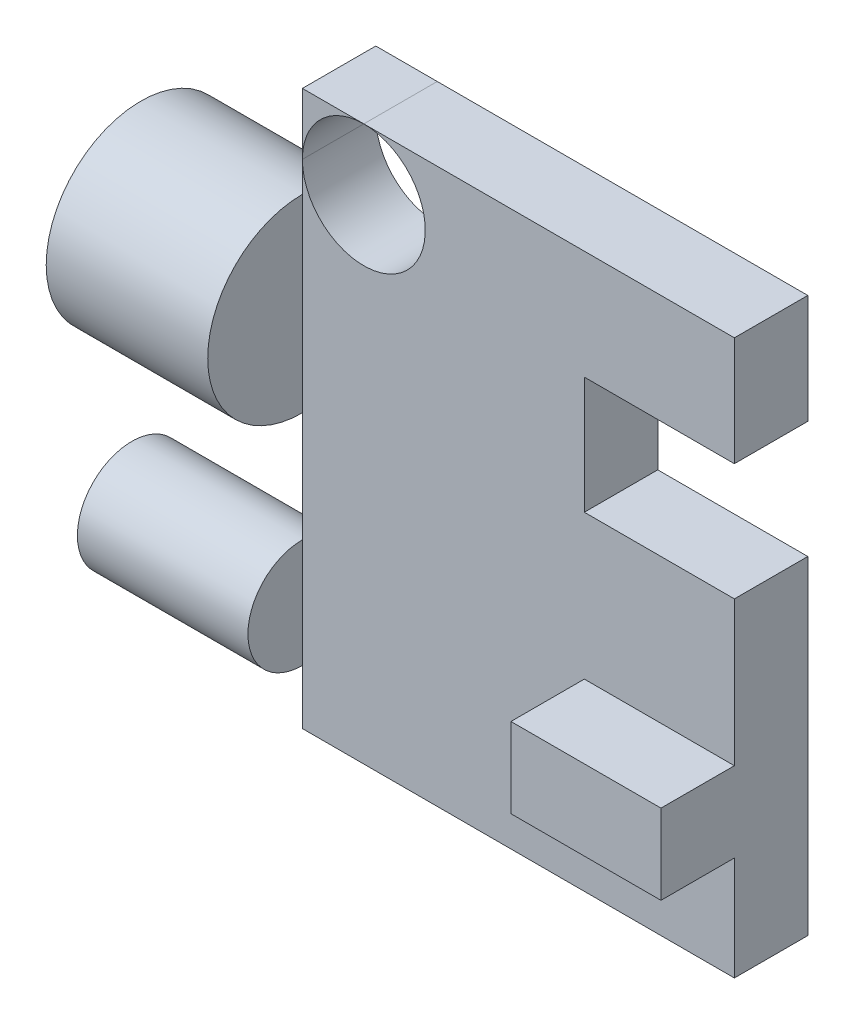
ISO-10303-21;
HEADER;
FILE_DESCRIPTION(('STEP AP214'),'2;1');
FILE_NAME('part.step','',(''),(''),'','','');
FILE_SCHEMA(('AUTOMOTIVE_DESIGN { 1 0 10303 214 1 1 1 1 }'));
ENDSEC;
DATA;
#1=APPLICATION_CONTEXT('core data for automotive mechanical design processes');
#2=APPLICATION_PROTOCOL_DEFINITION('international standard','automotive_design',2000,#1);
#3=PRODUCT_CONTEXT('',#1,'mechanical');
#4=PRODUCT('Part','Part','',(#3));
#5=PRODUCT_RELATED_PRODUCT_CATEGORY('part','',(#4));
#6=PRODUCT_DEFINITION_FORMATION('','',#4);
#7=PRODUCT_DEFINITION_CONTEXT('part definition',#1,'design');
#8=PRODUCT_DEFINITION('design','',#6,#7);
#9=PRODUCT_DEFINITION_SHAPE('','',#8);
#10=(LENGTH_UNIT() NAMED_UNIT(*) SI_UNIT(.MILLI.,.METRE.));
#11=(NAMED_UNIT(*) PLANE_ANGLE_UNIT() SI_UNIT($,.RADIAN.));
#12=(NAMED_UNIT(*) SI_UNIT($,.STERADIAN.) SOLID_ANGLE_UNIT());
#13=UNCERTAINTY_MEASURE_WITH_UNIT(LENGTH_MEASURE(1.E-05),#10,'distance_accuracy_value','');
#14=(GEOMETRIC_REPRESENTATION_CONTEXT(3) GLOBAL_UNCERTAINTY_ASSIGNED_CONTEXT((#13)) GLOBAL_UNIT_ASSIGNED_CONTEXT((#10,
#11,#12)) REPRESENTATION_CONTEXT('',''));
#15=CARTESIAN_POINT('',(0.,0.,0.));
#16=DIRECTION('',(0.,0.,1.));
#17=DIRECTION('',(1.,0.,0.));
#18=AXIS2_PLACEMENT_3D('',#15,#16,#17);
#19=CARTESIAN_POINT('',(0.,0.,10.));
#20=DIRECTION('',(1.,0.,0.));
#21=DIRECTION('',(0.,0.,-1.));
#22=AXIS2_PLACEMENT_3D('',#19,#20,#21);
#23=PLANE('',#22);
#24=DIRECTION('',(0.,0.,1.));
#25=VECTOR('',#24,1.);
#26=CARTESIAN_POINT('',(0.,67.1497486725571,0.));
#27=LINE('',#26,#25);
#28=CARTESIAN_POINT('',(0.,67.1497486725571,0.));
#29=VERTEX_POINT('',#28);
#30=CARTESIAN_POINT('',(0.,67.1497486725571,10.));
#31=VERTEX_POINT('',#30);
#32=EDGE_CURVE('E214',#29,#31,#27,.T.);
#33=ORIENTED_EDGE('',*,*,#32,.F.);
#34=DIRECTION('',(0.,-1.,0.));
#35=VECTOR('',#34,1.);
#36=CARTESIAN_POINT('',(0.,0.,0.));
#37=LINE('',#36,#35);
#38=CARTESIAN_POINT('',(0.,58.2671488390325,0.));
#39=VERTEX_POINT('',#38);
#40=EDGE_CURVE('E223',#29,#39,#37,.T.);
#41=ORIENTED_EDGE('',*,*,#40,.T.);
#42=CARTESIAN_POINT('',(0.,50.131757446474,10.));
#43=DIRECTION('',(-1.,0.,0.));
#44=DIRECTION('',(0.,0.,1.));
#45=AXIS2_PLACEMENT_3D('',#42,#43,#44);
#46=CIRCLE('',#45,12.8912603383112);
#47=CARTESIAN_POINT('',(0.,63.0230177847852,10.));
#48=VERTEX_POINT('',#47);
#49=EDGE_CURVE('E253',#48,#39,#46,.T.);
#50=ORIENTED_EDGE('',*,*,#49,.F.);
#51=DIRECTION('',(0.,-1.,0.));
#52=VECTOR('',#51,1.);
#53=CARTESIAN_POINT('',(0.,0.,10.));
#54=LINE('',#53,#52);
#55=EDGE_CURVE('E216',#31,#48,#54,.T.);
#56=ORIENTED_EDGE('',*,*,#55,.F.);
#57=EDGE_LOOP('',(#33,#41,#50,#56));
#58=FACE_BOUND('',#57,.T.);
#59=ADVANCED_FACE('F55',(#58),#23,.F.);
#60=CARTESIAN_POINT('',(0.,0.,10.));
#61=DIRECTION('',(0.,0.,-1.));
#62=DIRECTION('',(-1.,0.,0.));
#63=AXIS2_PLACEMENT_3D('',#60,#61,#62);
#64=PLANE('',#63);
#65=DIRECTION('',(-1.,0.,0.));
#66=VECTOR('',#65,1.);
#67=CARTESIAN_POINT('',(0.,75.5206119855441,10.));
#68=LINE('',#67,#66);
#69=CARTESIAN_POINT('',(58.8472301186058,75.5206119855441,10.));
#70=VERTEX_POINT('',#69);
#71=CARTESIAN_POINT('',(8.37086331298698,75.5206119855441,10.));
#72=VERTEX_POINT('',#71);
#73=EDGE_CURVE('E219',#70,#72,#68,.T.);
#74=ORIENTED_EDGE('',*,*,#73,.T.);
#75=CARTESIAN_POINT('',(8.37086331298698,67.1497486725571,10.));
#76=DIRECTION('',(0.,0.,1.));
#77=DIRECTION('',(1.,0.,0.));
#78=AXIS2_PLACEMENT_3D('',#75,#76,#77);
#79=CIRCLE('',#78,8.37086331298698);
#80=EDGE_CURVE('E59',#31,#72,#79,.T.);
#81=ORIENTED_EDGE('',*,*,#80,.F.);
#82=ORIENTED_EDGE('',*,*,#55,.T.);
#83=CARTESIAN_POINT('',(0.,37.2404971081628,10.));
#84=VERTEX_POINT('',#83);
#85=EDGE_CURVE('E218',#48,#84,#54,.T.);
#86=ORIENTED_EDGE('',*,*,#85,.T.);
#87=CARTESIAN_POINT('',(0.,22.2700012314142,10.));
#88=VERTEX_POINT('',#87);
#89=EDGE_CURVE('E328',#84,#88,#54,.T.);
#90=ORIENTED_EDGE('',*,*,#89,.T.);
#91=CARTESIAN_POINT('',(0.,7.43812105722822,10.));
#92=VERTEX_POINT('',#91);
#93=EDGE_CURVE('E545',#88,#92,#54,.T.);
#94=ORIENTED_EDGE('',*,*,#93,.T.);
#95=CARTESIAN_POINT('',(0.,0.,10.));
#96=VERTEX_POINT('',#95);
#97=EDGE_CURVE('E220',#92,#96,#54,.T.);
#98=ORIENTED_EDGE('',*,*,#97,.T.);
#99=DIRECTION('',(1.,0.,0.));
#100=VECTOR('',#99,1.);
#101=CARTESIAN_POINT('',(0.,0.,10.));
#102=LINE('',#101,#100);
#103=CARTESIAN_POINT('',(58.8472301186058,0.,10.));
#104=VERTEX_POINT('',#103);
#105=EDGE_CURVE('E249',#96,#104,#102,.T.);
#106=ORIENTED_EDGE('',*,*,#105,.T.);
#107=DIRECTION('',(0.,1.,0.));
#108=VECTOR('',#107,1.);
#109=CARTESIAN_POINT('',(58.8472301186058,75.5206119855441,10.));
#110=LINE('',#109,#108);
#111=CARTESIAN_POINT('',(58.8472301186058,14.1609826315088,10.));
#112=VERTEX_POINT('',#111);
#113=EDGE_CURVE('E210',#104,#112,#110,.T.);
#114=ORIENTED_EDGE('',*,*,#113,.T.);
#115=DIRECTION('',(-1.,0.,0.));
#116=VECTOR('',#115,1.);
#117=CARTESIAN_POINT('',(0.,14.1609826315088,10.));
#118=LINE('',#117,#116);
#119=CARTESIAN_POINT('',(38.4092967616959,14.1609826315088,10.));
#120=VERTEX_POINT('',#119);
#121=EDGE_CURVE('E208',#112,#120,#118,.T.);
#122=ORIENTED_EDGE('',*,*,#121,.T.);
#123=DIRECTION('',(0.,-1.,0.));
#124=VECTOR('',#123,1.);
#125=CARTESIAN_POINT('',(38.4092967616959,0.,10.));
#126=LINE('',#125,#124);
#127=CARTESIAN_POINT('',(38.4092967616959,25.0423152826639,10.));
#128=VERTEX_POINT('',#127);
#129=EDGE_CURVE('E192',#128,#120,#126,.T.);
#130=ORIENTED_EDGE('',*,*,#129,.F.);
#131=DIRECTION('',(-1.,0.,0.));
#132=VECTOR('',#131,1.);
#133=CARTESIAN_POINT('',(0.,25.0423152826639,10.));
#134=LINE('',#133,#132);
#135=CARTESIAN_POINT('',(58.8472301186058,25.0423152826639,10.));
#136=VERTEX_POINT('',#135);
#137=EDGE_CURVE('E190',#136,#128,#134,.T.);
#138=ORIENTED_EDGE('',*,*,#137,.F.);
#139=CARTESIAN_POINT('',(58.8472301186058,44.725745046537,10.));
#140=VERTEX_POINT('',#139);
#141=EDGE_CURVE('E209',#136,#140,#110,.T.);
#142=ORIENTED_EDGE('',*,*,#141,.T.);
#143=DIRECTION('',(-1.,0.,0.));
#144=VECTOR('',#143,1.);
#145=CARTESIAN_POINT('',(0.,44.725745046537,10.));
#146=LINE('',#145,#144);
#147=CARTESIAN_POINT('',(38.4092967616959,44.725745046537,10.));
#148=VERTEX_POINT('',#147);
#149=EDGE_CURVE('E279',#140,#148,#146,.T.);
#150=ORIENTED_EDGE('',*,*,#149,.T.);
#151=DIRECTION('',(0.,-1.,0.));
#152=VECTOR('',#151,1.);
#153=CARTESIAN_POINT('',(38.4092967616959,0.,10.));
#154=LINE('',#153,#152);
#155=CARTESIAN_POINT('',(38.4092967616959,60.6665508412229,10.));
#156=VERTEX_POINT('',#155);
#157=EDGE_CURVE('E271',#156,#148,#154,.T.);
#158=ORIENTED_EDGE('',*,*,#157,.F.);
#159=DIRECTION('',(-1.,0.,0.));
#160=VECTOR('',#159,1.);
#161=CARTESIAN_POINT('',(0.,60.6665508412229,10.));
#162=LINE('',#161,#160);
#163=CARTESIAN_POINT('',(58.8472301186058,60.6665508412229,10.));
#164=VERTEX_POINT('',#163);
#165=EDGE_CURVE('E269',#164,#156,#162,.T.);
#166=ORIENTED_EDGE('',*,*,#165,.F.);
#167=EDGE_CURVE('E250',#164,#70,#110,.T.);
#168=ORIENTED_EDGE('',*,*,#167,.T.);
#169=EDGE_LOOP('',(#74,#81,#82,#86,#90,#94,#98,#106,#114,#122,#130,#138,#142,#150,#158,#166,#168));
#170=FACE_BOUND('',#169,.T.);
#171=ADVANCED_FACE('F305',(#170),#64,.F.);
#172=CARTESIAN_POINT('',(58.8472301186058,75.5206119855441,10.));
#173=DIRECTION('',(-1.,0.,0.));
#174=DIRECTION('',(0.,0.,1.));
#175=AXIS2_PLACEMENT_3D('',#172,#173,#174);
#176=PLANE('',#175);
#177=DIRECTION('',(0.,0.,1.));
#178=VECTOR('',#177,1.);
#179=CARTESIAN_POINT('',(58.8472301186058,44.725745046537,0.));
#180=LINE('',#179,#178);
#181=CARTESIAN_POINT('',(58.8472301186058,44.725745046537,0.));
#182=VERTEX_POINT('',#181);
#183=EDGE_CURVE('E206',#182,#140,#180,.T.);
#184=ORIENTED_EDGE('',*,*,#183,.T.);
#185=ORIENTED_EDGE('',*,*,#141,.F.);
#186=DIRECTION('',(0.,0.,-1.));
#187=VECTOR('',#186,1.);
#188=CARTESIAN_POINT('',(58.8472301186058,25.0423152826639,20.));
#189=LINE('',#188,#187);
#190=CARTESIAN_POINT('',(58.8472301186058,25.0423152826639,20.));
#191=VERTEX_POINT('',#190);
#192=EDGE_CURVE('E195',#191,#136,#189,.T.);
#193=ORIENTED_EDGE('',*,*,#192,.F.);
#194=DIRECTION('',(0.,1.,0.));
#195=VECTOR('',#194,1.);
#196=CARTESIAN_POINT('',(58.8472301186058,0.,20.));
#197=LINE('',#196,#195);
#198=CARTESIAN_POINT('',(58.8472301186058,14.1609826315088,20.));
#199=VERTEX_POINT('',#198);
#200=EDGE_CURVE('E178',#199,#191,#197,.T.);
#201=ORIENTED_EDGE('',*,*,#200,.F.);
#202=DIRECTION('',(0.,0.,-1.));
#203=VECTOR('',#202,1.);
#204=CARTESIAN_POINT('',(58.8472301186058,14.1609826315088,20.));
#205=LINE('',#204,#203);
#206=EDGE_CURVE('E202',#199,#112,#205,.T.);
#207=ORIENTED_EDGE('',*,*,#206,.T.);
#208=ORIENTED_EDGE('',*,*,#113,.F.);
#209=DIRECTION('',(0.,0.,-1.));
#210=VECTOR('',#209,1.);
#211=CARTESIAN_POINT('',(58.8472301186058,0.,10.));
#212=LINE('',#211,#210);
#213=CARTESIAN_POINT('',(58.8472301186058,0.,0.));
#214=VERTEX_POINT('',#213);
#215=EDGE_CURVE('E205',#104,#214,#212,.T.);
#216=ORIENTED_EDGE('',*,*,#215,.T.);
#217=DIRECTION('',(0.,1.,0.));
#218=VECTOR('',#217,1.);
#219=CARTESIAN_POINT('',(58.8472301186058,75.5206119855441,0.));
#220=LINE('',#219,#218);
#221=EDGE_CURVE('E243',#214,#182,#220,.T.);
#222=ORIENTED_EDGE('',*,*,#221,.T.);
#223=EDGE_LOOP('',(#184,#185,#193,#201,#207,#208,#216,#222));
#224=FACE_BOUND('',#223,.T.);
#225=ADVANCED_FACE('F310',(#224),#176,.F.);
#226=CARTESIAN_POINT('',(0.,0.,10.));
#227=DIRECTION('',(0.,1.,0.));
#228=DIRECTION('',(0.,0.,1.));
#229=AXIS2_PLACEMENT_3D('',#226,#227,#228);
#230=PLANE('',#229);
#231=DIRECTION('',(1.,0.,0.));
#232=VECTOR('',#231,1.);
#233=CARTESIAN_POINT('',(0.,0.,0.));
#234=LINE('',#233,#232);
#235=CARTESIAN_POINT('',(0.,0.,0.));
#236=VERTEX_POINT('',#235);
#237=EDGE_CURVE('E242',#236,#214,#234,.T.);
#238=ORIENTED_EDGE('',*,*,#237,.T.);
#239=ORIENTED_EDGE('',*,*,#215,.F.);
#240=ORIENTED_EDGE('',*,*,#105,.F.);
#241=DIRECTION('',(0.,0.,-1.));
#242=VECTOR('',#241,1.);
#243=CARTESIAN_POINT('',(0.,0.,10.));
#244=LINE('',#243,#242);
#245=EDGE_CURVE('E239',#96,#236,#244,.T.);
#246=ORIENTED_EDGE('',*,*,#245,.T.);
#247=EDGE_LOOP('',(#238,#239,#240,#246));
#248=FACE_BOUND('',#247,.T.);
#249=ADVANCED_FACE('F317',(#248),#230,.F.);
#250=ORIENTED_EDGE('',*,*,#167,.F.);
#251=DIRECTION('',(0.,0.,1.));
#252=VECTOR('',#251,1.);
#253=CARTESIAN_POINT('',(58.8472301186058,60.6665508412229,0.));
#254=LINE('',#253,#252);
#255=CARTESIAN_POINT('',(58.8472301186058,60.6665508412229,0.));
#256=VERTEX_POINT('',#255);
#257=EDGE_CURVE('E277',#256,#164,#254,.T.);
#258=ORIENTED_EDGE('',*,*,#257,.F.);
#259=CARTESIAN_POINT('',(58.8472301186058,75.5206119855441,0.));
#260=VERTEX_POINT('',#259);
#261=EDGE_CURVE('E229',#256,#260,#220,.T.);
#262=ORIENTED_EDGE('',*,*,#261,.T.);
#263=DIRECTION('',(0.,0.,-1.));
#264=VECTOR('',#263,1.);
#265=CARTESIAN_POINT('',(58.8472301186058,75.5206119855441,10.));
#266=LINE('',#265,#264);
#267=EDGE_CURVE('E230',#70,#260,#266,.T.);
#268=ORIENTED_EDGE('',*,*,#267,.F.);
#269=EDGE_LOOP('',(#250,#258,#262,#268));
#270=FACE_BOUND('',#269,.T.);
#271=ADVANCED_FACE('F302',(#270),#176,.F.);
#272=CARTESIAN_POINT('',(0.,75.5206119855441,10.));
#273=DIRECTION('',(0.,-1.,0.));
#274=DIRECTION('',(0.,0.,-1.));
#275=AXIS2_PLACEMENT_3D('',#272,#273,#274);
#276=PLANE('',#275);
#277=DIRECTION('',(-1.,0.,0.));
#278=VECTOR('',#277,1.);
#279=CARTESIAN_POINT('',(0.,75.5206119855441,0.));
#280=LINE('',#279,#278);
#281=CARTESIAN_POINT('',(8.37086331298698,75.5206119855441,0.));
#282=VERTEX_POINT('',#281);
#283=EDGE_CURVE('E227',#260,#282,#280,.T.);
#284=ORIENTED_EDGE('',*,*,#283,.T.);
#285=DIRECTION('',(0.,0.,1.));
#286=VECTOR('',#285,1.);
#287=CARTESIAN_POINT('',(8.37086331298698,75.5206119855441,0.));
#288=LINE('',#287,#286);
#289=EDGE_CURVE('E75',#282,#72,#288,.T.);
#290=ORIENTED_EDGE('',*,*,#289,.T.);
#291=ORIENTED_EDGE('',*,*,#73,.F.);
#292=ORIENTED_EDGE('',*,*,#267,.T.);
#293=EDGE_LOOP('',(#284,#290,#291,#292));
#294=FACE_BOUND('',#293,.T.);
#295=ADVANCED_FACE('F343',(#294),#276,.F.);
#296=CARTESIAN_POINT('',(0.,14.8540611443212,10.));
#297=DIRECTION('',(-1.,0.,0.));
#298=DIRECTION('',(0.,-1.,0.));
#299=AXIS2_PLACEMENT_3D('',#296,#297,#298);
#300=CIRCLE('',#299,7.41594008709301);
#301=EDGE_CURVE('E265',#88,#92,#300,.T.);
#302=ORIENTED_EDGE('',*,*,#301,.F.);
#303=ORIENTED_EDGE('',*,*,#89,.F.);
#304=CARTESIAN_POINT('',(0.,41.9963660539154,0.));
#305=VERTEX_POINT('',#304);
#306=EDGE_CURVE('E258',#305,#84,#46,.T.);
#307=ORIENTED_EDGE('',*,*,#306,.F.);
#308=EDGE_CURVE('E226',#305,#236,#37,.T.);
#309=ORIENTED_EDGE('',*,*,#308,.T.);
#310=ORIENTED_EDGE('',*,*,#245,.F.);
#311=ORIENTED_EDGE('',*,*,#97,.F.);
#312=EDGE_LOOP('',(#302,#303,#307,#309,#310,#311));
#313=FACE_BOUND('',#312,.T.);
#314=ADVANCED_FACE('F323',(#313),#23,.F.);
#315=CARTESIAN_POINT('',(0.,0.,0.));
#316=DIRECTION('',(0.,0.,-1.));
#317=DIRECTION('',(-1.,0.,0.));
#318=AXIS2_PLACEMENT_3D('',#315,#316,#317);
#319=PLANE('',#318);
#320=CARTESIAN_POINT('',(8.37086331298698,67.1497486725571,0.));
#321=DIRECTION('',(0.,0.,-1.));
#322=DIRECTION('',(-1.,0.,0.));
#323=AXIS2_PLACEMENT_3D('',#320,#321,#322);
#324=CIRCLE('',#323,8.37086331298698);
#325=EDGE_CURVE('E12',#282,#29,#324,.T.);
#326=ORIENTED_EDGE('',*,*,#325,.F.);
#327=ORIENTED_EDGE('',*,*,#283,.F.);
#328=ORIENTED_EDGE('',*,*,#261,.F.);
#329=DIRECTION('',(-1.,0.,0.));
#330=VECTOR('',#329,1.);
#331=CARTESIAN_POINT('',(0.,60.6665508412229,0.));
#332=LINE('',#331,#330);
#333=CARTESIAN_POINT('',(38.4092967616959,60.6665508412229,0.));
#334=VERTEX_POINT('',#333);
#335=EDGE_CURVE('E199',#256,#334,#332,.T.);
#336=ORIENTED_EDGE('',*,*,#335,.T.);
#337=DIRECTION('',(0.,-1.,0.));
#338=VECTOR('',#337,1.);
#339=CARTESIAN_POINT('',(38.4092967616959,0.,0.));
#340=LINE('',#339,#338);
#341=CARTESIAN_POINT('',(38.4092967616959,44.725745046537,0.));
#342=VERTEX_POINT('',#341);
#343=EDGE_CURVE('E287',#334,#342,#340,.T.);
#344=ORIENTED_EDGE('',*,*,#343,.T.);
#345=DIRECTION('',(-1.,0.,0.));
#346=VECTOR('',#345,1.);
#347=CARTESIAN_POINT('',(0.,44.725745046537,0.));
#348=LINE('',#347,#346);
#349=EDGE_CURVE('E274',#182,#342,#348,.T.);
#350=ORIENTED_EDGE('',*,*,#349,.F.);
#351=ORIENTED_EDGE('',*,*,#221,.F.);
#352=ORIENTED_EDGE('',*,*,#237,.F.);
#353=ORIENTED_EDGE('',*,*,#308,.F.);
#354=EDGE_CURVE('E225',#39,#305,#37,.T.);
#355=ORIENTED_EDGE('',*,*,#354,.F.);
#356=ORIENTED_EDGE('',*,*,#40,.F.);
#357=EDGE_LOOP('',(#326,#327,#328,#336,#344,#350,#351,#352,#353,#355,#356));
#358=FACE_BOUND('',#357,.T.);
#359=ADVANCED_FACE('F295',(#358),#319,.T.);
#360=CARTESIAN_POINT('',(0.,63.0230177847852,10.));
#361=DIRECTION('',(-1.,0.,0.));
#362=DIRECTION('',(0.,0.,1.));
#363=AXIS2_PLACEMENT_3D('',#360,#361,#362);
#364=PLANE('',#363);
#365=EDGE_CURVE('E256',#39,#305,#46,.T.);
#366=ORIENTED_EDGE('',*,*,#365,.F.);
#367=ORIENTED_EDGE('',*,*,#354,.T.);
#368=EDGE_LOOP('',(#366,#367));
#369=FACE_BOUND('',#368,.T.);
#370=ADVANCED_FACE('F337',(#369),#364,.F.);
#371=ORIENTED_EDGE('',*,*,#85,.F.);
#372=EDGE_CURVE('E257',#84,#48,#46,.T.);
#373=ORIENTED_EDGE('',*,*,#372,.F.);
#374=EDGE_LOOP('',(#371,#373));
#375=FACE_BOUND('',#374,.T.);
#376=ADVANCED_FACE('F365',(#375),#364,.F.);
#377=CARTESIAN_POINT('',(-22.0028105913794,50.131757446474,10.));
#378=DIRECTION('',(-1.,0.,0.));
#379=DIRECTION('',(0.,0.,1.));
#380=AXIS2_PLACEMENT_3D('',#377,#378,#379);
#381=CYLINDRICAL_SURFACE('',#380,12.8912603383112);
#382=CARTESIAN_POINT('',(-22.0028105913794,50.131757446474,10.));
#383=DIRECTION('',(-1.,0.,0.));
#384=DIRECTION('',(0.,0.,1.));
#385=AXIS2_PLACEMENT_3D('',#382,#383,#384);
#386=CIRCLE('',#385,12.8912603383112);
#387=CARTESIAN_POINT('',(-22.0028105913794,50.131757446474,22.8912603383112));
#388=VERTEX_POINT('',#387);
#389=EDGE_CURVE('E259',#388,#388,#386,.T.);
#390=ORIENTED_EDGE('',*,*,#389,.F.);
#391=EDGE_LOOP('',(#390));
#392=FACE_BOUND('',#391,.T.);
#393=ORIENTED_EDGE('',*,*,#49,.T.);
#394=ORIENTED_EDGE('',*,*,#365,.T.);
#395=ORIENTED_EDGE('',*,*,#306,.T.);
#396=ORIENTED_EDGE('',*,*,#372,.T.);
#397=EDGE_LOOP('',(#393,#394,#395,#396));
#398=FACE_BOUND('',#397,.T.);
#399=ADVANCED_FACE('F334',(#392,#398),#381,.T.);
#400=CARTESIAN_POINT('',(-22.0028105913794,63.0230177847852,10.));
#401=DIRECTION('',(1.,0.,0.));
#402=DIRECTION('',(0.,0.,-1.));
#403=AXIS2_PLACEMENT_3D('',#400,#401,#402);
#404=PLANE('',#403);
#405=ORIENTED_EDGE('',*,*,#389,.T.);
#406=EDGE_LOOP('',(#405));
#407=FACE_BOUND('',#406,.T.);
#408=ADVANCED_FACE('F371',(#407),#404,.F.);
#409=CARTESIAN_POINT('',(0.,14.8540611443212,10.));
#410=DIRECTION('',(-1.,0.,0.));
#411=DIRECTION('',(0.,-1.,0.));
#412=AXIS2_PLACEMENT_3D('',#409,#410,#411);
#413=PLANE('',#412);
#414=EDGE_CURVE('E262',#92,#88,#300,.T.);
#415=ORIENTED_EDGE('',*,*,#414,.F.);
#416=ORIENTED_EDGE('',*,*,#93,.F.);
#417=EDGE_LOOP('',(#415,#416));
#418=FACE_BOUND('',#417,.T.);
#419=ADVANCED_FACE('F375',(#418),#413,.F.);
#420=CARTESIAN_POINT('',(-23.2318088564139,14.8540611443212,10.));
#421=DIRECTION('',(-1.,0.,0.));
#422=DIRECTION('',(0.,-1.,0.));
#423=AXIS2_PLACEMENT_3D('',#420,#421,#422);
#424=CYLINDRICAL_SURFACE('',#423,7.41594008709301);
#425=CARTESIAN_POINT('',(-23.2318088564139,14.8540611443212,10.));
#426=DIRECTION('',(-1.,0.,0.));
#427=DIRECTION('',(0.,-1.,0.));
#428=AXIS2_PLACEMENT_3D('',#425,#426,#427);
#429=CIRCLE('',#428,7.41594008709301);
#430=CARTESIAN_POINT('',(-23.2318088564139,7.43812105722822,10.));
#431=VERTEX_POINT('',#430);
#432=EDGE_CURVE('E266',#431,#431,#429,.T.);
#433=ORIENTED_EDGE('',*,*,#432,.F.);
#434=EDGE_LOOP('',(#433));
#435=FACE_BOUND('',#434,.T.);
#436=ORIENTED_EDGE('',*,*,#414,.T.);
#437=ORIENTED_EDGE('',*,*,#301,.T.);
#438=EDGE_LOOP('',(#436,#437));
#439=FACE_BOUND('',#438,.T.);
#440=ADVANCED_FACE('F379',(#435,#439),#424,.T.);
#441=CARTESIAN_POINT('',(-23.2318088564139,22.2700012314142,10.));
#442=DIRECTION('',(1.,0.,0.));
#443=DIRECTION('',(0.,1.,0.));
#444=AXIS2_PLACEMENT_3D('',#441,#442,#443);
#445=PLANE('',#444);
#446=ORIENTED_EDGE('',*,*,#432,.T.);
#447=EDGE_LOOP('',(#446));
#448=FACE_BOUND('',#447,.T.);
#449=ADVANCED_FACE('F383',(#448),#445,.F.);
#450=CARTESIAN_POINT('',(0.,60.6665508412229,0.));
#451=DIRECTION('',(0.,1.,0.));
#452=DIRECTION('',(0.,0.,1.));
#453=AXIS2_PLACEMENT_3D('',#450,#451,#452);
#454=PLANE('',#453);
#455=ORIENTED_EDGE('',*,*,#165,.T.);
#456=DIRECTION('',(0.,0.,1.));
#457=VECTOR('',#456,1.);
#458=CARTESIAN_POINT('',(38.4092967616959,60.6665508412229,0.));
#459=LINE('',#458,#457);
#460=EDGE_CURVE('E213',#334,#156,#459,.T.);
#461=ORIENTED_EDGE('',*,*,#460,.F.);
#462=ORIENTED_EDGE('',*,*,#335,.F.);
#463=ORIENTED_EDGE('',*,*,#257,.T.);
#464=EDGE_LOOP('',(#455,#461,#462,#463));
#465=FACE_BOUND('',#464,.T.);
#466=ADVANCED_FACE('F298',(#465),#454,.F.);
#467=CARTESIAN_POINT('',(0.,44.725745046537,0.));
#468=DIRECTION('',(0.,1.,0.));
#469=DIRECTION('',(0.,0.,1.));
#470=AXIS2_PLACEMENT_3D('',#467,#468,#469);
#471=PLANE('',#470);
#472=ORIENTED_EDGE('',*,*,#149,.F.);
#473=ORIENTED_EDGE('',*,*,#183,.F.);
#474=ORIENTED_EDGE('',*,*,#349,.T.);
#475=DIRECTION('',(0.,0.,1.));
#476=VECTOR('',#475,1.);
#477=CARTESIAN_POINT('',(38.4092967616959,44.725745046537,0.));
#478=LINE('',#477,#476);
#479=EDGE_CURVE('E272',#342,#148,#478,.T.);
#480=ORIENTED_EDGE('',*,*,#479,.T.);
#481=EDGE_LOOP('',(#472,#473,#474,#480));
#482=FACE_BOUND('',#481,.T.);
#483=ADVANCED_FACE('F309',(#482),#471,.T.);
#484=CARTESIAN_POINT('',(38.4092967616959,0.,0.));
#485=DIRECTION('',(-1.,0.,0.));
#486=DIRECTION('',(0.,0.,1.));
#487=AXIS2_PLACEMENT_3D('',#484,#485,#486);
#488=PLANE('',#487);
#489=ORIENTED_EDGE('',*,*,#157,.T.);
#490=ORIENTED_EDGE('',*,*,#479,.F.);
#491=ORIENTED_EDGE('',*,*,#343,.F.);
#492=ORIENTED_EDGE('',*,*,#460,.T.);
#493=EDGE_LOOP('',(#489,#490,#491,#492));
#494=FACE_BOUND('',#493,.T.);
#495=ADVANCED_FACE('F390',(#494),#488,.F.);
#496=CARTESIAN_POINT('',(0.,25.0423152826639,20.));
#497=DIRECTION('',(0.,-1.,0.));
#498=DIRECTION('',(0.,0.,-1.));
#499=AXIS2_PLACEMENT_3D('',#496,#497,#498);
#500=PLANE('',#499);
#501=ORIENTED_EDGE('',*,*,#137,.T.);
#502=DIRECTION('',(0.,0.,-1.));
#503=VECTOR('',#502,1.);
#504=CARTESIAN_POINT('',(38.4092967616959,25.0423152826639,20.));
#505=LINE('',#504,#503);
#506=CARTESIAN_POINT('',(38.4092967616959,25.0423152826639,20.));
#507=VERTEX_POINT('',#506);
#508=EDGE_CURVE('E171',#507,#128,#505,.T.);
#509=ORIENTED_EDGE('',*,*,#508,.F.);
#510=DIRECTION('',(-1.,0.,0.));
#511=VECTOR('',#510,1.);
#512=CARTESIAN_POINT('',(0.,25.0423152826639,20.));
#513=LINE('',#512,#511);
#514=EDGE_CURVE('E179',#191,#507,#513,.T.);
#515=ORIENTED_EDGE('',*,*,#514,.F.);
#516=ORIENTED_EDGE('',*,*,#192,.T.);
#517=EDGE_LOOP('',(#501,#509,#515,#516));
#518=FACE_BOUND('',#517,.T.);
#519=ADVANCED_FACE('F188',(#518),#500,.F.);
#520=CARTESIAN_POINT('',(38.4092967616959,0.,20.));
#521=DIRECTION('',(1.,0.,0.));
#522=DIRECTION('',(0.,0.,-1.));
#523=AXIS2_PLACEMENT_3D('',#520,#521,#522);
#524=PLANE('',#523);
#525=ORIENTED_EDGE('',*,*,#129,.T.);
#526=DIRECTION('',(0.,0.,-1.));
#527=VECTOR('',#526,1.);
#528=CARTESIAN_POINT('',(38.4092967616959,14.1609826315088,20.));
#529=LINE('',#528,#527);
#530=CARTESIAN_POINT('',(38.4092967616959,14.1609826315088,20.));
#531=VERTEX_POINT('',#530);
#532=EDGE_CURVE('E174',#531,#120,#529,.T.);
#533=ORIENTED_EDGE('',*,*,#532,.F.);
#534=DIRECTION('',(0.,-1.,0.));
#535=VECTOR('',#534,1.);
#536=CARTESIAN_POINT('',(38.4092967616959,0.,20.));
#537=LINE('',#536,#535);
#538=EDGE_CURVE('E166',#507,#531,#537,.T.);
#539=ORIENTED_EDGE('',*,*,#538,.F.);
#540=ORIENTED_EDGE('',*,*,#508,.T.);
#541=EDGE_LOOP('',(#525,#533,#539,#540));
#542=FACE_BOUND('',#541,.T.);
#543=ADVANCED_FACE('F169',(#542),#524,.F.);
#544=CARTESIAN_POINT('',(0.,14.1609826315088,20.));
#545=DIRECTION('',(0.,-1.,0.));
#546=DIRECTION('',(0.,0.,-1.));
#547=AXIS2_PLACEMENT_3D('',#544,#545,#546);
#548=PLANE('',#547);
#549=ORIENTED_EDGE('',*,*,#121,.F.);
#550=ORIENTED_EDGE('',*,*,#206,.F.);
#551=DIRECTION('',(-1.,0.,0.));
#552=VECTOR('',#551,1.);
#553=CARTESIAN_POINT('',(0.,14.1609826315088,20.));
#554=LINE('',#553,#552);
#555=EDGE_CURVE('E191',#199,#531,#554,.T.);
#556=ORIENTED_EDGE('',*,*,#555,.T.);
#557=ORIENTED_EDGE('',*,*,#532,.T.);
#558=EDGE_LOOP('',(#549,#550,#556,#557));
#559=FACE_BOUND('',#558,.T.);
#560=ADVANCED_FACE('F400',(#559),#548,.T.);
#561=CARTESIAN_POINT('',(0.,0.,20.));
#562=DIRECTION('',(0.,0.,1.));
#563=DIRECTION('',(1.,0.,0.));
#564=AXIS2_PLACEMENT_3D('',#561,#562,#563);
#565=PLANE('',#564);
#566=ORIENTED_EDGE('',*,*,#514,.T.);
#567=ORIENTED_EDGE('',*,*,#538,.T.);
#568=ORIENTED_EDGE('',*,*,#555,.F.);
#569=ORIENTED_EDGE('',*,*,#200,.T.);
#570=EDGE_LOOP('',(#566,#567,#568,#569));
#571=FACE_BOUND('',#570,.T.);
#572=ADVANCED_FACE('F182',(#571),#565,.T.);
#573=CARTESIAN_POINT('',(8.37086331298698,67.1497486725571,0.));
#574=DIRECTION('',(0.,0.,1.));
#575=DIRECTION('',(1.,0.,0.));
#576=AXIS2_PLACEMENT_3D('',#573,#574,#575);
#577=CYLINDRICAL_SURFACE('',#576,8.37086331298698);
#578=ORIENTED_EDGE('',*,*,#32,.T.);
#579=ORIENTED_EDGE('',*,*,#80,.T.);
#580=ORIENTED_EDGE('',*,*,#289,.F.);
#581=ORIENTED_EDGE('',*,*,#325,.T.);
#582=EDGE_LOOP('',(#578,#579,#580,#581));
#583=FACE_BOUND('',#582,.T.);
#584=ADVANCED_FACE('F57',(#583),#577,.F.);
#585=CLOSED_SHELL('',(#59,#171,#225,#249,#271,#295,#314,#359,#370,#376,#399,#408,#419,#440,#449,
#466,#483,#495,#519,#543,#560,#572,#584));
#586=MANIFOLD_SOLID_BREP('B2',#585);
#587=CARTESIAN_POINT('',(0.,0.,0.));
#588=DIRECTION('',(0.,0.,-1.));
#589=DIRECTION('',(-1.,0.,0.));
#590=AXIS2_PLACEMENT_3D('',#587,#588,#589);
#591=PLANE('',#590);
#592=CARTESIAN_POINT('',(8.37086331298698,67.1497486725571,0.));
#593=DIRECTION('',(0.,0.,1.));
#594=DIRECTION('',(1.,0.,0.));
#595=AXIS2_PLACEMENT_3D('',#592,#593,#594);
#596=CIRCLE('',#595,8.37086331298698);
#597=CARTESIAN_POINT('',(8.37086331298698,75.5206119855441,0.));
#598=VERTEX_POINT('',#597);
#599=CARTESIAN_POINT('',(0.,67.1497486725571,0.));
#600=VERTEX_POINT('',#599);
#601=EDGE_CURVE('E585',#598,#600,#596,.T.);
#602=ORIENTED_EDGE('',*,*,#601,.T.);
#603=DIRECTION('',(0.,-1.,0.));
#604=VECTOR('',#603,1.);
#605=CARTESIAN_POINT('',(0.,0.,0.));
#606=LINE('',#605,#604);
#607=CARTESIAN_POINT('',(0.,75.5206119855441,0.));
#608=VERTEX_POINT('',#607);
#609=EDGE_CURVE('E598',#608,#600,#606,.T.);
#610=ORIENTED_EDGE('',*,*,#609,.F.);
#611=DIRECTION('',(-1.,0.,0.));
#612=VECTOR('',#611,1.);
#613=CARTESIAN_POINT('',(0.,75.5206119855441,0.));
#614=LINE('',#613,#612);
#615=EDGE_CURVE('E594',#598,#608,#614,.T.);
#616=ORIENTED_EDGE('',*,*,#615,.F.);
#617=EDGE_LOOP('',(#602,#610,#616));
#618=FACE_BOUND('',#617,.T.);
#619=ADVANCED_FACE('F553',(#618),#591,.T.);
#620=CARTESIAN_POINT('',(0.,75.5206119855441,10.));
#621=DIRECTION('',(0.,-1.,0.));
#622=DIRECTION('',(0.,0.,-1.));
#623=AXIS2_PLACEMENT_3D('',#620,#621,#622);
#624=PLANE('',#623);
#625=DIRECTION('',(0.,0.,1.));
#626=VECTOR('',#625,1.);
#627=CARTESIAN_POINT('',(8.37086331298698,75.5206119855441,0.));
#628=LINE('',#627,#626);
#629=CARTESIAN_POINT('',(8.37086331298698,75.5206119855441,10.));
#630=VERTEX_POINT('',#629);
#631=EDGE_CURVE('E568',#598,#630,#628,.T.);
#632=ORIENTED_EDGE('',*,*,#631,.F.);
#633=ORIENTED_EDGE('',*,*,#615,.T.);
#634=DIRECTION('',(0.,0.,-1.));
#635=VECTOR('',#634,1.);
#636=CARTESIAN_POINT('',(0.,75.5206119855441,10.));
#637=LINE('',#636,#635);
#638=CARTESIAN_POINT('',(0.,75.5206119855441,10.));
#639=VERTEX_POINT('',#638);
#640=EDGE_CURVE('E53',#639,#608,#637,.T.);
#641=ORIENTED_EDGE('',*,*,#640,.F.);
#642=DIRECTION('',(-1.,0.,0.));
#643=VECTOR('',#642,1.);
#644=CARTESIAN_POINT('',(0.,75.5206119855441,10.));
#645=LINE('',#644,#643);
#646=EDGE_CURVE('E595',#630,#639,#645,.T.);
#647=ORIENTED_EDGE('',*,*,#646,.F.);
#648=EDGE_LOOP('',(#632,#633,#641,#647));
#649=FACE_BOUND('',#648,.T.);
#650=ADVANCED_FACE('F555',(#649),#624,.F.);
#651=CARTESIAN_POINT('',(0.,0.,10.));
#652=DIRECTION('',(1.,0.,0.));
#653=DIRECTION('',(0.,0.,-1.));
#654=AXIS2_PLACEMENT_3D('',#651,#652,#653);
#655=PLANE('',#654);
#656=ORIENTED_EDGE('',*,*,#609,.T.);
#657=DIRECTION('',(0.,0.,1.));
#658=VECTOR('',#657,1.);
#659=CARTESIAN_POINT('',(0.,67.1497486725571,0.));
#660=LINE('',#659,#658);
#661=CARTESIAN_POINT('',(0.,67.1497486725571,10.));
#662=VERTEX_POINT('',#661);
#663=EDGE_CURVE('E573',#600,#662,#660,.T.);
#664=ORIENTED_EDGE('',*,*,#663,.T.);
#665=DIRECTION('',(0.,-1.,0.));
#666=VECTOR('',#665,1.);
#667=CARTESIAN_POINT('',(0.,0.,10.));
#668=LINE('',#667,#666);
#669=EDGE_CURVE('E561',#639,#662,#668,.T.);
#670=ORIENTED_EDGE('',*,*,#669,.F.);
#671=ORIENTED_EDGE('',*,*,#640,.T.);
#672=EDGE_LOOP('',(#656,#664,#670,#671));
#673=FACE_BOUND('',#672,.T.);
#674=ADVANCED_FACE('F608',(#673),#655,.F.);
#675=CARTESIAN_POINT('',(0.,0.,10.));
#676=DIRECTION('',(0.,0.,-1.));
#677=DIRECTION('',(-1.,0.,0.));
#678=AXIS2_PLACEMENT_3D('',#675,#676,#677);
#679=PLANE('',#678);
#680=ORIENTED_EDGE('',*,*,#669,.T.);
#681=CARTESIAN_POINT('',(8.37086331298698,67.1497486725571,10.));
#682=DIRECTION('',(0.,0.,1.));
#683=DIRECTION('',(1.,0.,0.));
#684=AXIS2_PLACEMENT_3D('',#681,#682,#683);
#685=CIRCLE('',#684,8.37086331298698);
#686=EDGE_CURVE('E590',#630,#662,#685,.T.);
#687=ORIENTED_EDGE('',*,*,#686,.F.);
#688=ORIENTED_EDGE('',*,*,#646,.T.);
#689=EDGE_LOOP('',(#680,#687,#688));
#690=FACE_BOUND('',#689,.T.);
#691=ADVANCED_FACE('F609',(#690),#679,.F.);
#692=CARTESIAN_POINT('',(8.37086331298698,67.1497486725571,0.));
#693=DIRECTION('',(0.,0.,1.));
#694=DIRECTION('',(1.,0.,0.));
#695=AXIS2_PLACEMENT_3D('',#692,#693,#694);
#696=CYLINDRICAL_SURFACE('',#695,8.37086331298698);
#697=ORIENTED_EDGE('',*,*,#601,.F.);
#698=ORIENTED_EDGE('',*,*,#631,.T.);
#699=ORIENTED_EDGE('',*,*,#686,.T.);
#700=ORIENTED_EDGE('',*,*,#663,.F.);
#701=EDGE_LOOP('',(#697,#698,#699,#700));
#702=FACE_BOUND('',#701,.T.);
#703=ADVANCED_FACE('F586',(#702),#696,.F.);
#704=CLOSED_SHELL('',(#619,#650,#674,#691,#703));
#705=MANIFOLD_SOLID_BREP('B6',#704);
#706=ADVANCED_BREP_SHAPE_REPRESENTATION('',(#18,#586,#705),#14);
#707=SHAPE_DEFINITION_REPRESENTATION(#9,#706);
ENDSEC;
END-ISO-10303-21;
